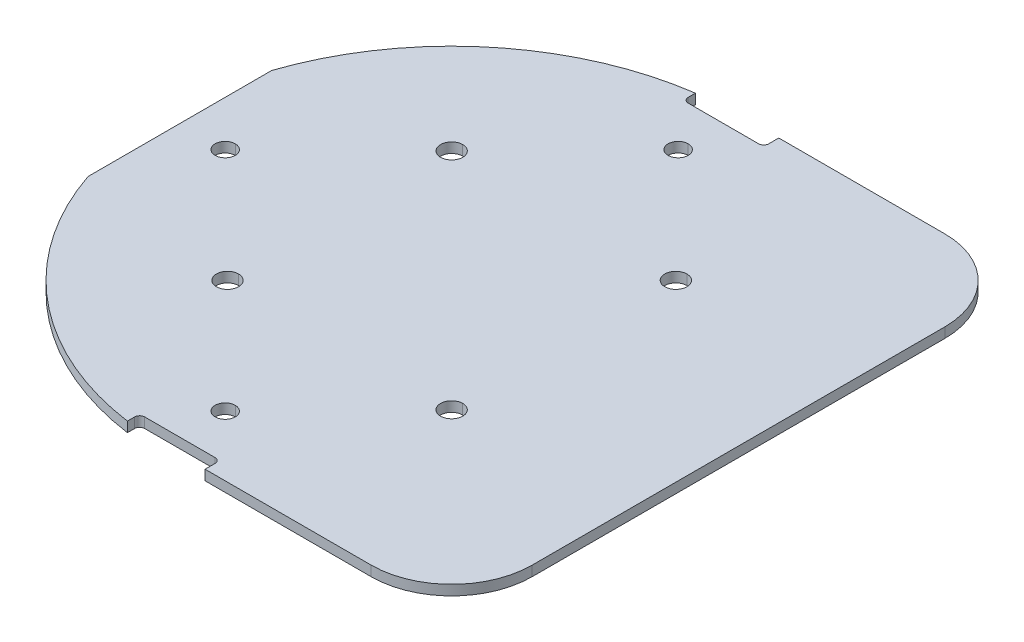
ISO-10303-21;
HEADER;
FILE_DESCRIPTION(('STEP AP214'),'2;1');
FILE_NAME('part.step','',(''),(''),'','','');
FILE_SCHEMA(('AUTOMOTIVE_DESIGN { 1 0 10303 214 1 1 1 1 }'));
ENDSEC;
DATA;
#1=APPLICATION_CONTEXT('core data for automotive mechanical design processes');
#2=APPLICATION_PROTOCOL_DEFINITION('international standard','automotive_design',2000,#1);
#3=PRODUCT_CONTEXT('',#1,'mechanical');
#4=PRODUCT('Part','Part','',(#3));
#5=PRODUCT_RELATED_PRODUCT_CATEGORY('part','',(#4));
#6=PRODUCT_DEFINITION_FORMATION('','',#4);
#7=PRODUCT_DEFINITION_CONTEXT('part definition',#1,'design');
#8=PRODUCT_DEFINITION('design','',#6,#7);
#9=PRODUCT_DEFINITION_SHAPE('','',#8);
#10=(LENGTH_UNIT() NAMED_UNIT(*) SI_UNIT(.MILLI.,.METRE.));
#11=(NAMED_UNIT(*) PLANE_ANGLE_UNIT() SI_UNIT($,.RADIAN.));
#12=(NAMED_UNIT(*) SI_UNIT($,.STERADIAN.) SOLID_ANGLE_UNIT());
#13=UNCERTAINTY_MEASURE_WITH_UNIT(LENGTH_MEASURE(1.E-05),#10,'distance_accuracy_value','');
#14=(GEOMETRIC_REPRESENTATION_CONTEXT(3) GLOBAL_UNCERTAINTY_ASSIGNED_CONTEXT((#13)) GLOBAL_UNIT_ASSIGNED_CONTEXT((#10,
#11,#12)) REPRESENTATION_CONTEXT('',''));
#15=CARTESIAN_POINT('',(0.,0.,0.));
#16=DIRECTION('',(0.,0.,1.));
#17=DIRECTION('',(1.,0.,0.));
#18=AXIS2_PLACEMENT_3D('',#15,#16,#17);
#19=CARTESIAN_POINT('',(-22.5,0.999999999999361,0.));
#20=DIRECTION('',(0.,-1.,0.));
#21=DIRECTION('',(0.,0.,-1.));
#22=AXIS2_PLACEMENT_3D('',#19,#20,#21);
#23=CYLINDRICAL_SURFACE('',#22,0.999999999999987);
#24=DIRECTION('',(0.,-1.,0.));
#25=VECTOR('',#24,1.);
#26=CARTESIAN_POINT('',(-22.5,0.5,-1.));
#27=LINE('',#26,#25);
#28=CARTESIAN_POINT('',(-22.5,1.,-1.));
#29=VERTEX_POINT('',#28);
#30=CARTESIAN_POINT('',(-22.5,0.,-1.));
#31=VERTEX_POINT('',#30);
#32=EDGE_CURVE('E560',#29,#31,#27,.T.);
#33=ORIENTED_EDGE('',*,*,#32,.F.);
#34=CARTESIAN_POINT('',(-22.4999999999981,1.,1.32533689224539E-12));
#35=DIRECTION('',(-6.3946244133235E-13,1.,0.));
#36=DIRECTION('',(-1.90125692966806E-12,0.,-1.));
#37=AXIS2_PLACEMENT_3D('',#34,#35,#36);
#38=CIRCLE('',#37,1.00000000000128);
#39=CARTESIAN_POINT('',(-22.5,0.999999999999361,1.));
#40=VERTEX_POINT('',#39);
#41=EDGE_CURVE('E578',#29,#40,#38,.T.);
#42=ORIENTED_EDGE('',*,*,#41,.T.);
#43=DIRECTION('',(0.,-1.,0.));
#44=VECTOR('',#43,1.);
#45=CARTESIAN_POINT('',(-22.5,0.499999999999361,1.));
#46=LINE('',#45,#44);
#47=CARTESIAN_POINT('',(-22.5,-6.3948846218409E-13,1.));
#48=VERTEX_POINT('',#47);
#49=EDGE_CURVE('E553',#40,#48,#46,.T.);
#50=ORIENTED_EDGE('',*,*,#49,.T.);
#51=CARTESIAN_POINT('',(-22.4999999999981,0.,1.32533689224539E-12));
#52=DIRECTION('',(-6.39427229844532E-13,1.,0.));
#53=DIRECTION('',(-1.90125692966806E-12,0.,-1.));
#54=AXIS2_PLACEMENT_3D('',#51,#52,#53);
#55=CIRCLE('',#54,1.00000000000128);
#56=EDGE_CURVE('E1241',#31,#48,#55,.T.);
#57=ORIENTED_EDGE('',*,*,#56,.F.);
#58=EDGE_LOOP('',(#33,#42,#50,#57));
#59=FACE_BOUND('',#58,.T.);
#60=ADVANCED_FACE('F16',(#59),#23,.F.);
#61=CARTESIAN_POINT('',(0.,1.,22.5));
#62=DIRECTION('',(0.,-1.,0.));
#63=DIRECTION('',(0.,0.,-1.));
#64=AXIS2_PLACEMENT_3D('',#61,#62,#63);
#65=CYLINDRICAL_SURFACE('',#64,0.999999999999988);
#66=DIRECTION('',(0.,-1.,0.));
#67=VECTOR('',#66,1.);
#68=CARTESIAN_POINT('',(0.,0.5,21.5));
#69=LINE('',#68,#67);
#70=CARTESIAN_POINT('',(0.,1.,21.5));
#71=VERTEX_POINT('',#70);
#72=CARTESIAN_POINT('',(0.,0.,21.5));
#73=VERTEX_POINT('',#72);
#74=EDGE_CURVE('E545',#71,#73,#69,.T.);
#75=ORIENTED_EDGE('',*,*,#74,.F.);
#76=CARTESIAN_POINT('',(2.57779908530485E-12,1.,22.5000000000013));
#77=DIRECTION('',(0.,1.,0.));
#78=DIRECTION('',(-2.57779908530149E-12,0.,-1.));
#79=AXIS2_PLACEMENT_3D('',#76,#77,#78);
#80=CIRCLE('',#79,1.00000000000127);
#81=CARTESIAN_POINT('',(0.,1.,23.5));
#82=VERTEX_POINT('',#81);
#83=EDGE_CURVE('E11',#71,#82,#80,.T.);
#84=ORIENTED_EDGE('',*,*,#83,.T.);
#85=DIRECTION('',(0.,-1.,0.));
#86=VECTOR('',#85,1.);
#87=CARTESIAN_POINT('',(0.,0.5,23.5));
#88=LINE('',#87,#86);
#89=CARTESIAN_POINT('',(0.,0.,23.5));
#90=VERTEX_POINT('',#89);
#91=EDGE_CURVE('E537',#82,#90,#88,.T.);
#92=ORIENTED_EDGE('',*,*,#91,.T.);
#93=CARTESIAN_POINT('',(2.60555466092052E-12,0.,22.5000000000013));
#94=DIRECTION('',(0.,1.,0.));
#95=DIRECTION('',(-2.60555466091713E-12,0.,-1.));
#96=AXIS2_PLACEMENT_3D('',#93,#94,#95);
#97=CIRCLE('',#96,1.00000000000128);
#98=EDGE_CURVE('E914',#73,#90,#97,.T.);
#99=ORIENTED_EDGE('',*,*,#98,.F.);
#100=EDGE_LOOP('',(#75,#84,#92,#99));
#101=FACE_BOUND('',#100,.T.);
#102=ADVANCED_FACE('F1002',(#101),#65,.F.);
#103=CARTESIAN_POINT('',(-11.136931804,1.0000000003119,11.136931804));
#104=DIRECTION('',(0.,-1.,0.));
#105=DIRECTION('',(0.,0.,-1.));
#106=AXIS2_PLACEMENT_3D('',#103,#104,#105);
#107=CYLINDRICAL_SURFACE('',#106,1.1);
#108=DIRECTION('',(0.,-1.,0.));
#109=VECTOR('',#108,1.);
#110=CARTESIAN_POINT('',(-11.136931804,0.5,10.036931804));
#111=LINE('',#110,#109);
#112=CARTESIAN_POINT('',(-11.136931804,1.,10.036931804));
#113=VERTEX_POINT('',#112);
#114=CARTESIAN_POINT('',(-11.136931804,0.,10.036931804));
#115=VERTEX_POINT('',#114);
#116=EDGE_CURVE('E529',#113,#115,#111,.T.);
#117=ORIENTED_EDGE('',*,*,#116,.F.);
#118=CARTESIAN_POINT('',(-11.1369318036881,1.,11.136931804));
#119=DIRECTION('',(2.83545874675836E-10,1.,0.));
#120=DIRECTION('',(-2.83543706191093E-10,0.,-1.));
#121=AXIS2_PLACEMENT_3D('',#118,#119,#120);
#122=CIRCLE('',#121,1.1);
#123=CARTESIAN_POINT('',(-11.136931804,1.0000000003119,12.236931804));
#124=VERTEX_POINT('',#123);
#125=EDGE_CURVE('E872',#113,#124,#122,.T.);
#126=ORIENTED_EDGE('',*,*,#125,.T.);
#127=DIRECTION('',(0.,-1.,0.));
#128=VECTOR('',#127,1.);
#129=CARTESIAN_POINT('',(-11.136931804,0.500000000311901,12.236931804));
#130=LINE('',#129,#128);
#131=CARTESIAN_POINT('',(-11.136931804,3.11901546257154E-10,12.236931804));
#132=VERTEX_POINT('',#131);
#133=EDGE_CURVE('E521',#124,#132,#130,.T.);
#134=ORIENTED_EDGE('',*,*,#133,.T.);
#135=CARTESIAN_POINT('',(-11.1369318036881,0.,11.136931804));
#136=DIRECTION('',(2.83546984627368E-10,1.,0.));
#137=DIRECTION('',(-2.83543706191093E-10,0.,-1.));
#138=AXIS2_PLACEMENT_3D('',#135,#136,#137);
#139=CIRCLE('',#138,1.1);
#140=EDGE_CURVE('E912',#115,#132,#139,.T.);
#141=ORIENTED_EDGE('',*,*,#140,.F.);
#142=EDGE_LOOP('',(#117,#126,#134,#141));
#143=FACE_BOUND('',#142,.T.);
#144=ADVANCED_FACE('F993',(#143),#107,.F.);
#145=CARTESIAN_POINT('',(0.,1.,-22.5));
#146=DIRECTION('',(0.,-1.,0.));
#147=DIRECTION('',(0.,0.,-1.));
#148=AXIS2_PLACEMENT_3D('',#145,#146,#147);
#149=CYLINDRICAL_SURFACE('',#148,1.00000000000001);
#150=DIRECTION('',(0.,-1.,0.));
#151=VECTOR('',#150,1.);
#152=CARTESIAN_POINT('',(0.,0.5,-23.5));
#153=LINE('',#152,#151);
#154=CARTESIAN_POINT('',(0.,1.,-23.5));
#155=VERTEX_POINT('',#154);
#156=CARTESIAN_POINT('',(0.,0.,-23.5));
#157=VERTEX_POINT('',#156);
#158=EDGE_CURVE('E513',#155,#157,#153,.T.);
#159=ORIENTED_EDGE('',*,*,#158,.F.);
#160=CARTESIAN_POINT('',(0.,1.,-22.5));
#161=DIRECTION('',(0.,1.,0.));
#162=DIRECTION('',(0.,0.,-1.));
#163=AXIS2_PLACEMENT_3D('',#160,#161,#162);
#164=CIRCLE('',#163,0.999999999999991);
#165=CARTESIAN_POINT('',(0.,1.,-21.5));
#166=VERTEX_POINT('',#165);
#167=EDGE_CURVE('E27',#155,#166,#164,.T.);
#168=ORIENTED_EDGE('',*,*,#167,.T.);
#169=DIRECTION('',(0.,-1.,0.));
#170=VECTOR('',#169,1.);
#171=CARTESIAN_POINT('',(0.,0.5,-21.5));
#172=LINE('',#171,#170);
#173=CARTESIAN_POINT('',(0.,0.,-21.5));
#174=VERTEX_POINT('',#173);
#175=EDGE_CURVE('E505',#166,#174,#172,.T.);
#176=ORIENTED_EDGE('',*,*,#175,.T.);
#177=CARTESIAN_POINT('',(0.,0.,-22.5));
#178=DIRECTION('',(0.,1.,0.));
#179=DIRECTION('',(0.,0.,-1.));
#180=AXIS2_PLACEMENT_3D('',#177,#178,#179);
#181=CIRCLE('',#180,0.999999999999991);
#182=EDGE_CURVE('E867',#157,#174,#181,.T.);
#183=ORIENTED_EDGE('',*,*,#182,.F.);
#184=EDGE_LOOP('',(#159,#168,#176,#183));
#185=FACE_BOUND('',#184,.T.);
#186=ADVANCED_FACE('F988',(#185),#149,.F.);
#187=CARTESIAN_POINT('',(11.136931804,1.0000000003119,11.136931804));
#188=DIRECTION('',(0.,-1.,0.));
#189=DIRECTION('',(0.,0.,-1.));
#190=AXIS2_PLACEMENT_3D('',#187,#188,#189);
#191=CYLINDRICAL_SURFACE('',#190,1.1);
#192=DIRECTION('',(0.,-1.,0.));
#193=VECTOR('',#192,1.);
#194=CARTESIAN_POINT('',(11.136931804,0.5,10.036931804));
#195=LINE('',#194,#193);
#196=CARTESIAN_POINT('',(11.136931804,1.,10.036931804));
#197=VERTEX_POINT('',#196);
#198=CARTESIAN_POINT('',(11.136931804,0.,10.036931804));
#199=VERTEX_POINT('',#198);
#200=EDGE_CURVE('E497',#197,#199,#195,.T.);
#201=ORIENTED_EDGE('',*,*,#200,.F.);
#202=CARTESIAN_POINT('',(11.1369318026076,0.999999999688101,11.1369318027524));
#203=DIRECTION('',(4.91114494869207E-10,1.,2.83544297366866E-10));
#204=DIRECTION('',(1.26580406653582E-09,2.8354429789569E-10,-1.));
#205=AXIS2_PLACEMENT_3D('',#202,#203,#204);
#206=CIRCLE('',#205,1.09999999875983);
#207=CARTESIAN_POINT('',(11.136931804,1.0000000003119,12.236931804));
#208=VERTEX_POINT('',#207);
#209=EDGE_CURVE('E896',#197,#208,#206,.T.);
#210=ORIENTED_EDGE('',*,*,#209,.T.);
#211=DIRECTION('',(0.,-1.,0.));
#212=VECTOR('',#211,1.);
#213=CARTESIAN_POINT('',(11.136931804,0.500000000311901,12.236931804));
#214=LINE('',#213,#212);
#215=CARTESIAN_POINT('',(11.136931804,3.11901546257154E-10,12.236931804));
#216=VERTEX_POINT('',#215);
#217=EDGE_CURVE('E489',#208,#216,#214,.T.);
#218=ORIENTED_EDGE('',*,*,#217,.T.);
#219=CARTESIAN_POINT('',(11.1369318026076,-3.11901749091702E-10,11.1369318027524));
#220=DIRECTION('',(4.91117783102196E-10,1.,2.83547045572078E-10));
#221=DIRECTION('',(1.26580722057851E-09,2.83547044950418E-10,-1.));
#222=AXIS2_PLACEMENT_3D('',#219,#220,#221);
#223=CIRCLE('',#222,1.09999999875983);
#224=EDGE_CURVE('E863',#199,#216,#223,.T.);
#225=ORIENTED_EDGE('',*,*,#224,.F.);
#226=EDGE_LOOP('',(#201,#210,#218,#225));
#227=FACE_BOUND('',#226,.T.);
#228=ADVANCED_FACE('F992',(#227),#191,.F.);
#229=CARTESIAN_POINT('',(11.136931804,0.999999999688099,-11.136931804));
#230=DIRECTION('',(0.,-1.,0.));
#231=DIRECTION('',(0.,0.,-1.));
#232=AXIS2_PLACEMENT_3D('',#229,#230,#231);
#233=CYLINDRICAL_SURFACE('',#232,1.1);
#234=DIRECTION('',(0.,-1.,0.));
#235=VECTOR('',#234,1.);
#236=CARTESIAN_POINT('',(11.136931804,0.5,-12.236931804));
#237=LINE('',#236,#235);
#238=CARTESIAN_POINT('',(11.136931804,1.,-12.236931804));
#239=VERTEX_POINT('',#238);
#240=CARTESIAN_POINT('',(11.136931804,0.,-12.236931804));
#241=VERTEX_POINT('',#240);
#242=EDGE_CURVE('E481',#239,#241,#237,.T.);
#243=ORIENTED_EDGE('',*,*,#242,.F.);
#244=CARTESIAN_POINT('',(11.1369318036881,1.0000000003119,-11.136931804));
#245=DIRECTION('',(-4.91116543758531E-10,1.,-2.83546268804393E-10));
#246=DIRECTION('',(2.83565784489879E-10,-2.83546268850774E-10,-1.));
#247=AXIS2_PLACEMENT_3D('',#244,#245,#246);
#248=CIRCLE('',#247,1.1);
#249=CARTESIAN_POINT('',(11.136931804,0.999999999688099,-10.036931804));
#250=VERTEX_POINT('',#249);
#251=EDGE_CURVE('E1283',#239,#250,#248,.T.);
#252=ORIENTED_EDGE('',*,*,#251,.T.);
#253=DIRECTION('',(0.,-1.,0.));
#254=VECTOR('',#253,1.);
#255=CARTESIAN_POINT('',(11.136931804,0.499999999688099,-10.036931804));
#256=LINE('',#255,#254);
#257=CARTESIAN_POINT('',(11.136931804,-3.11901685035032E-10,-10.036931804));
#258=VERTEX_POINT('',#257);
#259=EDGE_CURVE('E473',#250,#258,#256,.T.);
#260=ORIENTED_EDGE('',*,*,#259,.T.);
#261=CARTESIAN_POINT('',(11.1369318036881,3.11901480730735E-10,-11.136931804));
#262=DIRECTION('',(-4.91117571265659E-10,1.,-2.83546800803571E-10));
#263=DIRECTION('',(2.83568938532563E-10,-2.83546800664305E-10,-1.));
#264=AXIS2_PLACEMENT_3D('',#261,#262,#263);
#265=CIRCLE('',#264,1.1);
#266=EDGE_CURVE('E866',#241,#258,#265,.T.);
#267=ORIENTED_EDGE('',*,*,#266,.F.);
#268=EDGE_LOOP('',(#243,#252,#260,#267));
#269=FACE_BOUND('',#268,.T.);
#270=ADVANCED_FACE('F1019',(#269),#233,.F.);
#271=CARTESIAN_POINT('',(-11.136931804,0.999999999688099,-11.136931804));
#272=DIRECTION('',(0.,-1.,0.));
#273=DIRECTION('',(0.,0.,-1.));
#274=AXIS2_PLACEMENT_3D('',#271,#272,#273);
#275=CYLINDRICAL_SURFACE('',#274,1.1);
#276=DIRECTION('',(0.,-1.,0.));
#277=VECTOR('',#276,1.);
#278=CARTESIAN_POINT('',(-11.136931804,0.5,-12.236931804));
#279=LINE('',#278,#277);
#280=CARTESIAN_POINT('',(-11.136931804,1.,-12.236931804));
#281=VERTEX_POINT('',#280);
#282=CARTESIAN_POINT('',(-11.136931804,0.,-12.236931804));
#283=VERTEX_POINT('',#282);
#284=EDGE_CURVE('E465',#281,#283,#279,.T.);
#285=ORIENTED_EDGE('',*,*,#284,.F.);
#286=CARTESIAN_POINT('',(-11.1369318030644,1.,-11.1369318033763));
#287=DIRECTION('',(-2.83546071803503E-10,1.,0.));
#288=DIRECTION('',(-8.50542804895879E-10,0.,-1.));
#289=AXIS2_PLACEMENT_3D('',#286,#287,#288);
#290=CIRCLE('',#289,1.10000000060586);
#291=CARTESIAN_POINT('',(-11.136931804,0.999999999688099,-10.036931804));
#292=VERTEX_POINT('',#291);
#293=EDGE_CURVE('E899',#281,#292,#290,.T.);
#294=ORIENTED_EDGE('',*,*,#293,.T.);
#295=DIRECTION('',(0.,-1.,0.));
#296=VECTOR('',#295,1.);
#297=CARTESIAN_POINT('',(-11.136931804,0.499999999688099,-10.036931804));
#298=LINE('',#297,#296);
#299=CARTESIAN_POINT('',(-11.136931804,-3.11901685035032E-10,-10.036931804));
#300=VERTEX_POINT('',#299);
#301=EDGE_CURVE('E457',#292,#300,#298,.T.);
#302=ORIENTED_EDGE('',*,*,#301,.T.);
#303=CARTESIAN_POINT('',(-11.1369318030644,0.,-11.1369318033763));
#304=DIRECTION('',(-2.83546862162688E-10,1.,0.));
#305=DIRECTION('',(-8.50552267023926E-10,0.,-1.));
#306=AXIS2_PLACEMENT_3D('',#303,#304,#305);
#307=CIRCLE('',#306,1.10000000060587);
#308=EDGE_CURVE('E1277',#283,#300,#307,.T.);
#309=ORIENTED_EDGE('',*,*,#308,.F.);
#310=EDGE_LOOP('',(#285,#294,#302,#309));
#311=FACE_BOUND('',#310,.T.);
#312=ADVANCED_FACE('F944',(#311),#275,.F.);
#313=CARTESIAN_POINT('',(0.,0.,0.));
#314=DIRECTION('',(0.,1.,0.));
#315=DIRECTION('',(0.,0.,1.));
#316=AXIS2_PLACEMENT_3D('',#313,#314,#315);
#317=CYLINDRICAL_SURFACE('',#316,28.5000000000001);
#318=CARTESIAN_POINT('',(-1.13054531014622E-10,0.,2.8363509457785E-10));
#319=DIRECTION('',(0.,1.,0.));
#320=DIRECTION('',(-0.947368421060004,0.,0.320145396309669));
#321=AXIS2_PLACEMENT_3D('',#318,#319,#320);
#322=CIRCLE('',#321,28.4999999996614);
#323=CARTESIAN_POINT('',(-27.,0.,9.124143795));
#324=VERTEX_POINT('',#323);
#325=CARTESIAN_POINT('',(-4.,0.,28.217902119));
#326=VERTEX_POINT('',#325);
#327=EDGE_CURVE('E1264',#324,#326,#322,.T.);
#328=ORIENTED_EDGE('',*,*,#327,.T.);
#329=DIRECTION('',(0.,-1.,0.));
#330=VECTOR('',#329,1.);
#331=CARTESIAN_POINT('',(-4.,0.5,28.217902119));
#332=LINE('',#331,#330);
#333=CARTESIAN_POINT('',(-4.,1.,28.217902119));
#334=VERTEX_POINT('',#333);
#335=EDGE_CURVE('E375',#334,#326,#332,.T.);
#336=ORIENTED_EDGE('',*,*,#335,.F.);
#337=CARTESIAN_POINT('',(-1.13054531014622E-10,1.,2.8363509457785E-10));
#338=DIRECTION('',(0.,1.,0.));
#339=DIRECTION('',(-0.947368421060004,0.,0.320145396309669));
#340=AXIS2_PLACEMENT_3D('',#337,#338,#339);
#341=CIRCLE('',#340,28.4999999996614);
#342=CARTESIAN_POINT('',(-27.,1.,9.124143795));
#343=VERTEX_POINT('',#342);
#344=EDGE_CURVE('E873',#343,#334,#341,.T.);
#345=ORIENTED_EDGE('',*,*,#344,.F.);
#346=DIRECTION('',(0.,1.,0.));
#347=VECTOR('',#346,1.);
#348=CARTESIAN_POINT('',(-27.,0.5,9.124143795));
#349=LINE('',#348,#347);
#350=EDGE_CURVE('E332',#324,#343,#349,.T.);
#351=ORIENTED_EDGE('',*,*,#350,.F.);
#352=EDGE_LOOP('',(#328,#336,#345,#351));
#353=FACE_BOUND('',#352,.T.);
#354=ADVANCED_FACE('F940',(#353),#317,.T.);
#355=CARTESIAN_POINT('',(-27.0100000001357,1.,-28.51));
#356=DIRECTION('',(0.,1.,0.));
#357=DIRECTION('',(0.,0.,1.));
#358=AXIS2_PLACEMENT_3D('',#355,#356,#357);
#359=PLANE('',#358);
#360=ORIENTED_EDGE('',*,*,#83,.F.);
#361=CARTESIAN_POINT('',(2.62984078957746E-12,1.,22.5000000000013));
#362=DIRECTION('',(0.,1.,0.));
#363=DIRECTION('',(-2.62984078958088E-12,0.,1.));
#364=AXIS2_PLACEMENT_3D('',#361,#362,#363);
#365=CIRCLE('',#364,0.999999999998709);
#366=EDGE_CURVE('E549',#82,#71,#365,.T.);
#367=ORIENTED_EDGE('',*,*,#366,.F.);
#368=EDGE_LOOP('',(#360,#367));
#369=FACE_BOUND('',#368,.T.);
#370=ORIENTED_EDGE('',*,*,#167,.F.);
#371=CARTESIAN_POINT('',(0.,1.,-22.5));
#372=DIRECTION('',(0.,1.,0.));
#373=DIRECTION('',(0.,0.,1.));
#374=AXIS2_PLACEMENT_3D('',#371,#372,#373);
#375=CIRCLE('',#374,0.999999999999997);
#376=EDGE_CURVE('E517',#166,#155,#375,.T.);
#377=ORIENTED_EDGE('',*,*,#376,.F.);
#378=EDGE_LOOP('',(#370,#377));
#379=FACE_BOUND('',#378,.T.);
#380=ORIENTED_EDGE('',*,*,#251,.F.);
#381=CARTESIAN_POINT('',(11.1369318036881,0.999999999688099,-11.136931804));
#382=DIRECTION('',(0.,1.,0.));
#383=DIRECTION('',(2.83543706191093E-10,0.,1.));
#384=AXIS2_PLACEMENT_3D('',#381,#382,#383);
#385=CIRCLE('',#384,1.1);
#386=EDGE_CURVE('E485',#250,#239,#385,.T.);
#387=ORIENTED_EDGE('',*,*,#386,.F.);
#388=EDGE_LOOP('',(#380,#387));
#389=FACE_BOUND('',#388,.T.);
#390=ORIENTED_EDGE('',*,*,#293,.F.);
#391=CARTESIAN_POINT('',(-11.1369318026078,0.999999999688099,-11.1369318027526));
#392=DIRECTION('',(0.,1.,0.));
#393=DIRECTION('',(-1.26565898057199E-09,0.,1.));
#394=AXIS2_PLACEMENT_3D('',#391,#392,#393);
#395=CIRCLE('',#394,1.09999999876002);
#396=EDGE_CURVE('E469',#292,#281,#395,.T.);
#397=ORIENTED_EDGE('',*,*,#396,.F.);
#398=EDGE_LOOP('',(#390,#397));
#399=FACE_BOUND('',#398,.T.);
#400=ORIENTED_EDGE('',*,*,#209,.F.);
#401=CARTESIAN_POINT('',(11.1369318030643,1.0000000003119,11.1369318033762));
#402=DIRECTION('',(0.,1.,0.));
#403=DIRECTION('',(8.50632695112234E-10,0.,1.));
#404=AXIS2_PLACEMENT_3D('',#401,#402,#403);
#405=CIRCLE('',#404,1.10000000060596);
#406=EDGE_CURVE('E501',#208,#197,#405,.T.);
#407=ORIENTED_EDGE('',*,*,#406,.F.);
#408=EDGE_LOOP('',(#400,#407));
#409=FACE_BOUND('',#408,.T.);
#410=ORIENTED_EDGE('',*,*,#125,.F.);
#411=CARTESIAN_POINT('',(-11.1369318036882,1.0000000003119,11.1369318039998));
#412=DIRECTION('',(0.,1.,0.));
#413=DIRECTION('',(-2.83449084910545E-10,0.,1.));
#414=AXIS2_PLACEMENT_3D('',#411,#412,#413);
#415=CIRCLE('',#414,1.10000000000015);
#416=EDGE_CURVE('E533',#124,#113,#415,.T.);
#417=ORIENTED_EDGE('',*,*,#416,.F.);
#418=EDGE_LOOP('',(#410,#417));
#419=FACE_BOUND('',#418,.T.);
#420=ORIENTED_EDGE('',*,*,#41,.F.);
#421=CARTESIAN_POINT('',(-22.4999999999981,0.999999999999361,1.32920687665166E-12));
#422=DIRECTION('',(0.,1.,0.));
#423=DIRECTION('',(-1.90125692967311E-12,0.,1.));
#424=AXIS2_PLACEMENT_3D('',#421,#422,#423);
#425=CIRCLE('',#424,0.999999999998722);
#426=EDGE_CURVE('E20',#40,#29,#425,.T.);
#427=ORIENTED_EDGE('',*,*,#426,.F.);
#428=EDGE_LOOP('',(#420,#427));
#429=FACE_BOUND('',#428,.T.);
#430=DIRECTION('',(0.,0.,-1.));
#431=VECTOR('',#430,1.);
#432=CARTESIAN_POINT('',(4.,1.,28.));
#433=LINE('',#432,#431);
#434=CARTESIAN_POINT('',(4.,1.,28.5));
#435=VERTEX_POINT('',#434);
#436=CARTESIAN_POINT('',(4.,1.,27.5));
#437=VERTEX_POINT('',#436);
#438=EDGE_CURVE('E372',#435,#437,#433,.T.);
#439=ORIENTED_EDGE('',*,*,#438,.F.);
#440=DIRECTION('',(1.,0.,0.));
#441=VECTOR('',#440,1.);
#442=CARTESIAN_POINT('',(12.25,1.,28.5));
#443=LINE('',#442,#441);
#444=CARTESIAN_POINT('',(20.5,1.,28.5));
#445=VERTEX_POINT('',#444);
#446=EDGE_CURVE('E42',#435,#445,#443,.T.);
#447=ORIENTED_EDGE('',*,*,#446,.T.);
#448=CARTESIAN_POINT('',(20.5,1.,20.5));
#449=DIRECTION('',(0.,1.,0.));
#450=DIRECTION('',(0.,0.,1.));
#451=AXIS2_PLACEMENT_3D('',#448,#449,#450);
#452=CIRCLE('',#451,7.99999999999999);
#453=CARTESIAN_POINT('',(28.5,1.,20.5));
#454=VERTEX_POINT('',#453);
#455=EDGE_CURVE('E282',#445,#454,#452,.T.);
#456=ORIENTED_EDGE('',*,*,#455,.T.);
#457=DIRECTION('',(0.,0.,-1.));
#458=VECTOR('',#457,1.);
#459=CARTESIAN_POINT('',(28.5,1.,0.));
#460=LINE('',#459,#458);
#461=CARTESIAN_POINT('',(28.5,1.,-20.5));
#462=VERTEX_POINT('',#461);
#463=EDGE_CURVE('E275',#454,#462,#460,.T.);
#464=ORIENTED_EDGE('',*,*,#463,.T.);
#465=CARTESIAN_POINT('',(20.5,1.,-20.5));
#466=DIRECTION('',(0.,1.,0.));
#467=DIRECTION('',(1.,0.,0.));
#468=AXIS2_PLACEMENT_3D('',#465,#466,#467);
#469=CIRCLE('',#468,8.00000000000002);
#470=CARTESIAN_POINT('',(20.5,1.,-28.5));
#471=VERTEX_POINT('',#470);
#472=EDGE_CURVE('E279',#462,#471,#469,.T.);
#473=ORIENTED_EDGE('',*,*,#472,.T.);
#474=DIRECTION('',(-1.,0.,0.));
#475=VECTOR('',#474,1.);
#476=CARTESIAN_POINT('',(12.25,1.,-28.5));
#477=LINE('',#476,#475);
#478=CARTESIAN_POINT('',(4.,1.,-28.5));
#479=VERTEX_POINT('',#478);
#480=EDGE_CURVE('E314',#471,#479,#477,.T.);
#481=ORIENTED_EDGE('',*,*,#480,.T.);
#482=DIRECTION('',(0.,0.,-1.));
#483=VECTOR('',#482,1.);
#484=CARTESIAN_POINT('',(4.,1.,-28.));
#485=LINE('',#484,#483);
#486=CARTESIAN_POINT('',(4.,1.,-27.5));
#487=VERTEX_POINT('',#486);
#488=EDGE_CURVE('E340',#487,#479,#485,.T.);
#489=ORIENTED_EDGE('',*,*,#488,.F.);
#490=CARTESIAN_POINT('',(3.49999999999998,1.,-27.5));
#491=DIRECTION('',(0.,-1.,0.));
#492=DIRECTION('',(1.,0.,0.));
#493=AXIS2_PLACEMENT_3D('',#490,#491,#492);
#494=CIRCLE('',#493,0.500000000000009);
#495=CARTESIAN_POINT('',(3.5,1.,-27.));
#496=VERTEX_POINT('',#495);
#497=EDGE_CURVE('E413',#487,#496,#494,.T.);
#498=ORIENTED_EDGE('',*,*,#497,.T.);
#499=DIRECTION('',(1.,0.,0.));
#500=VECTOR('',#499,1.);
#501=CARTESIAN_POINT('',(0.,1.,-27.));
#502=LINE('',#501,#500);
#503=CARTESIAN_POINT('',(-3.5,1.,-27.));
#504=VERTEX_POINT('',#503);
#505=EDGE_CURVE('E347',#504,#496,#502,.T.);
#506=ORIENTED_EDGE('',*,*,#505,.F.);
#507=CARTESIAN_POINT('',(-3.50000000000003,1.,-27.5));
#508=DIRECTION('',(0.,-1.,0.));
#509=DIRECTION('',(0.,0.,1.));
#510=AXIS2_PLACEMENT_3D('',#507,#508,#509);
#511=CIRCLE('',#510,0.49999999999999);
#512=CARTESIAN_POINT('',(-4.,1.,-27.5));
#513=VERTEX_POINT('',#512);
#514=EDGE_CURVE('E397',#504,#513,#511,.T.);
#515=ORIENTED_EDGE('',*,*,#514,.T.);
#516=DIRECTION('',(0.,0.,1.));
#517=VECTOR('',#516,1.);
#518=CARTESIAN_POINT('',(-4.,1.,-27.8589510595));
#519=LINE('',#518,#517);
#520=CARTESIAN_POINT('',(-4.,1.,-28.217902119));
#521=VERTEX_POINT('',#520);
#522=EDGE_CURVE('E361',#521,#513,#519,.T.);
#523=ORIENTED_EDGE('',*,*,#522,.F.);
#524=CARTESIAN_POINT('',(-1.13077949781548E-10,1.,-2.83607339002234E-10));
#525=DIRECTION('',(0.,1.,0.));
#526=DIRECTION('',(-0.140350877190695,0.,-0.990101828738743));
#527=AXIS2_PLACEMENT_3D('',#524,#525,#526);
#528=CIRCLE('',#527,28.4999999996614);
#529=CARTESIAN_POINT('',(-27.,1.,-9.124143795));
#530=VERTEX_POINT('',#529);
#531=EDGE_CURVE('E838',#521,#530,#528,.T.);
#532=ORIENTED_EDGE('',*,*,#531,.T.);
#533=DIRECTION('',(0.,0.,-1.));
#534=VECTOR('',#533,1.);
#535=CARTESIAN_POINT('',(-27.,1.,0.));
#536=LINE('',#535,#534);
#537=EDGE_CURVE('E328',#343,#530,#536,.T.);
#538=ORIENTED_EDGE('',*,*,#537,.F.);
#539=ORIENTED_EDGE('',*,*,#344,.T.);
#540=DIRECTION('',(0.,0.,1.));
#541=VECTOR('',#540,1.);
#542=CARTESIAN_POINT('',(-4.,1.,27.8589510595));
#543=LINE('',#542,#541);
#544=CARTESIAN_POINT('',(-4.,1.,27.5));
#545=VERTEX_POINT('',#544);
#546=EDGE_CURVE('E379',#545,#334,#543,.T.);
#547=ORIENTED_EDGE('',*,*,#546,.F.);
#548=CARTESIAN_POINT('',(-3.5,1.,27.5));
#549=DIRECTION('',(0.,-1.,0.));
#550=DIRECTION('',(-1.,0.,0.));
#551=AXIS2_PLACEMENT_3D('',#548,#549,#550);
#552=CIRCLE('',#551,0.500000000000023);
#553=CARTESIAN_POINT('',(-3.5,1.,27.));
#554=VERTEX_POINT('',#553);
#555=EDGE_CURVE('E445',#545,#554,#552,.T.);
#556=ORIENTED_EDGE('',*,*,#555,.T.);
#557=DIRECTION('',(-1.,0.,0.));
#558=VECTOR('',#557,1.);
#559=CARTESIAN_POINT('',(0.,1.,27.));
#560=LINE('',#559,#558);
#561=CARTESIAN_POINT('',(3.5,1.,27.));
#562=VERTEX_POINT('',#561);
#563=EDGE_CURVE('E386',#562,#554,#560,.T.);
#564=ORIENTED_EDGE('',*,*,#563,.F.);
#565=CARTESIAN_POINT('',(3.49999999999997,1.,27.5));
#566=DIRECTION('',(0.,-1.,0.));
#567=DIRECTION('',(0.,0.,-1.));
#568=AXIS2_PLACEMENT_3D('',#565,#566,#567);
#569=CIRCLE('',#568,0.500000000000019);
#570=EDGE_CURVE('E429',#562,#437,#569,.T.);
#571=ORIENTED_EDGE('',*,*,#570,.T.);
#572=EDGE_LOOP('',(#439,#447,#456,#464,#473,#481,#489,#498,#506,#515,#523,#532,#538,#539,#547,
#556,#564,#571));
#573=FACE_BOUND('',#572,.T.);
#574=ADVANCED_FACE('F277',(#369,#379,#389,#399,#409,#419,#429,#573),#359,.T.);
#575=CARTESIAN_POINT('',(-27.0100000001357,0.,28.51));
#576=DIRECTION('',(0.,-1.,0.));
#577=DIRECTION('',(0.,0.,-1.));
#578=AXIS2_PLACEMENT_3D('',#575,#576,#577);
#579=PLANE('',#578);
#580=ORIENTED_EDGE('',*,*,#308,.T.);
#581=CARTESIAN_POINT('',(-11.1369318026078,-3.11901619712823E-10,-11.1369318027526));
#582=DIRECTION('',(0.,1.,0.));
#583=DIRECTION('',(-1.26565898057199E-09,0.,1.));
#584=AXIS2_PLACEMENT_3D('',#581,#582,#583);
#585=CIRCLE('',#584,1.09999999876001);
#586=EDGE_CURVE('E461',#300,#283,#585,.T.);
#587=ORIENTED_EDGE('',*,*,#586,.T.);
#588=EDGE_LOOP('',(#580,#587));
#589=FACE_BOUND('',#588,.T.);
#590=ORIENTED_EDGE('',*,*,#266,.T.);
#591=CARTESIAN_POINT('',(11.1369318036881,-3.11901617679458E-10,-11.136931804));
#592=DIRECTION('',(0.,1.,0.));
#593=DIRECTION('',(2.83543706191093E-10,0.,1.));
#594=AXIS2_PLACEMENT_3D('',#591,#592,#593);
#595=CIRCLE('',#594,1.1);
#596=EDGE_CURVE('E477',#258,#241,#595,.T.);
#597=ORIENTED_EDGE('',*,*,#596,.T.);
#598=EDGE_LOOP('',(#590,#597));
#599=FACE_BOUND('',#598,.T.);
#600=ORIENTED_EDGE('',*,*,#224,.T.);
#601=CARTESIAN_POINT('',(11.1369318030643,3.11901613612728E-10,11.1369318033762));
#602=DIRECTION('',(0.,1.,0.));
#603=DIRECTION('',(8.50629541069554E-10,0.,1.));
#604=AXIS2_PLACEMENT_3D('',#601,#602,#603);
#605=CIRCLE('',#604,1.10000000060596);
#606=EDGE_CURVE('E493',#216,#199,#605,.T.);
#607=ORIENTED_EDGE('',*,*,#606,.T.);
#608=EDGE_LOOP('',(#600,#607));
#609=FACE_BOUND('',#608,.T.);
#610=ORIENTED_EDGE('',*,*,#182,.T.);
#611=CARTESIAN_POINT('',(0.,0.,-22.5));
#612=DIRECTION('',(0.,1.,0.));
#613=DIRECTION('',(0.,0.,1.));
#614=AXIS2_PLACEMENT_3D('',#611,#612,#613);
#615=CIRCLE('',#614,0.999999999999997);
#616=EDGE_CURVE('E509',#174,#157,#615,.T.);
#617=ORIENTED_EDGE('',*,*,#616,.T.);
#618=EDGE_LOOP('',(#610,#617));
#619=FACE_BOUND('',#618,.T.);
#620=ORIENTED_EDGE('',*,*,#140,.T.);
#621=CARTESIAN_POINT('',(-11.1369318036883,3.11901611579362E-10,11.1369318039998));
#622=DIRECTION('',(0.,1.,0.));
#623=DIRECTION('',(-2.8338285001417E-10,0.,1.));
#624=AXIS2_PLACEMENT_3D('',#621,#622,#623);
#625=CIRCLE('',#624,1.10000000000024);
#626=EDGE_CURVE('E525',#132,#115,#625,.T.);
#627=ORIENTED_EDGE('',*,*,#626,.T.);
#628=EDGE_LOOP('',(#620,#627));
#629=FACE_BOUND('',#628,.T.);
#630=ORIENTED_EDGE('',*,*,#98,.T.);
#631=CARTESIAN_POINT('',(2.60902410786577E-12,0.,22.5000000000013));
#632=DIRECTION('',(0.,1.,0.));
#633=DIRECTION('',(-2.60902410786916E-12,0.,1.));
#634=AXIS2_PLACEMENT_3D('',#631,#632,#633);
#635=CIRCLE('',#634,0.999999999998718);
#636=EDGE_CURVE('E541',#90,#73,#635,.T.);
#637=ORIENTED_EDGE('',*,*,#636,.T.);
#638=EDGE_LOOP('',(#630,#637));
#639=FACE_BOUND('',#638,.T.);
#640=ORIENTED_EDGE('',*,*,#56,.T.);
#641=CARTESIAN_POINT('',(-22.4999999999981,-6.39427229844133E-13,1.32920687665166E-12));
#642=DIRECTION('',(0.,1.,0.));
#643=DIRECTION('',(-1.90125692967311E-12,0.,1.));
#644=AXIS2_PLACEMENT_3D('',#641,#642,#643);
#645=CIRCLE('',#644,0.999999999998722);
#646=EDGE_CURVE('E557',#48,#31,#645,.T.);
#647=ORIENTED_EDGE('',*,*,#646,.T.);
#648=EDGE_LOOP('',(#640,#647));
#649=FACE_BOUND('',#648,.T.);
#650=DIRECTION('',(1.,0.,0.));
#651=VECTOR('',#650,1.);
#652=CARTESIAN_POINT('',(12.25,0.,28.5));
#653=LINE('',#652,#651);
#654=CARTESIAN_POINT('',(4.,0.,28.5));
#655=VERTEX_POINT('',#654);
#656=CARTESIAN_POINT('',(20.5,0.,28.5));
#657=VERTEX_POINT('',#656);
#658=EDGE_CURVE('E830',#655,#657,#653,.T.);
#659=ORIENTED_EDGE('',*,*,#658,.F.);
#660=DIRECTION('',(0.,0.,1.));
#661=VECTOR('',#660,1.);
#662=CARTESIAN_POINT('',(4.,0.,28.));
#663=LINE('',#662,#661);
#664=CARTESIAN_POINT('',(4.,0.,27.5));
#665=VERTEX_POINT('',#664);
#666=EDGE_CURVE('E368',#665,#655,#663,.T.);
#667=ORIENTED_EDGE('',*,*,#666,.F.);
#668=CARTESIAN_POINT('',(3.5,0.,27.5));
#669=DIRECTION('',(0.,1.,0.));
#670=DIRECTION('',(1.,0.,0.));
#671=AXIS2_PLACEMENT_3D('',#668,#669,#670);
#672=CIRCLE('',#671,0.500000000000001);
#673=CARTESIAN_POINT('',(3.5,0.,27.));
#674=VERTEX_POINT('',#673);
#675=EDGE_CURVE('E437',#665,#674,#672,.T.);
#676=ORIENTED_EDGE('',*,*,#675,.T.);
#677=DIRECTION('',(1.,0.,0.));
#678=VECTOR('',#677,1.);
#679=CARTESIAN_POINT('',(0.,0.,27.));
#680=LINE('',#679,#678);
#681=CARTESIAN_POINT('',(-3.5,0.,27.));
#682=VERTEX_POINT('',#681);
#683=EDGE_CURVE('E390',#682,#674,#680,.T.);
#684=ORIENTED_EDGE('',*,*,#683,.F.);
#685=CARTESIAN_POINT('',(-3.49999999999998,0.,27.5));
#686=DIRECTION('',(0.,1.,0.));
#687=DIRECTION('',(0.,0.,-1.));
#688=AXIS2_PLACEMENT_3D('',#685,#686,#687);
#689=CIRCLE('',#688,0.500000000000013);
#690=CARTESIAN_POINT('',(-4.,0.,27.5));
#691=VERTEX_POINT('',#690);
#692=EDGE_CURVE('E453',#682,#691,#689,.T.);
#693=ORIENTED_EDGE('',*,*,#692,.T.);
#694=DIRECTION('',(0.,0.,-1.));
#695=VECTOR('',#694,1.);
#696=CARTESIAN_POINT('',(-4.,0.,27.8589510595));
#697=LINE('',#696,#695);
#698=EDGE_CURVE('E383',#326,#691,#697,.T.);
#699=ORIENTED_EDGE('',*,*,#698,.F.);
#700=ORIENTED_EDGE('',*,*,#327,.F.);
#701=DIRECTION('',(0.,0.,1.));
#702=VECTOR('',#701,1.);
#703=CARTESIAN_POINT('',(-27.,0.,0.));
#704=LINE('',#703,#702);
#705=CARTESIAN_POINT('',(-27.,0.,-9.124143795));
#706=VERTEX_POINT('',#705);
#707=EDGE_CURVE('E320',#706,#324,#704,.T.);
#708=ORIENTED_EDGE('',*,*,#707,.F.);
#709=CARTESIAN_POINT('',(-1.13015066055544E-10,0.,-2.83531878531029E-10));
#710=DIRECTION('',(0.,1.,0.));
#711=DIRECTION('',(-0.140350877190697,0.,-0.990101828738742));
#712=AXIS2_PLACEMENT_3D('',#709,#710,#711);
#713=CIRCLE('',#712,28.4999999996615);
#714=CARTESIAN_POINT('',(-4.,0.,-28.217902119));
#715=VERTEX_POINT('',#714);
#716=EDGE_CURVE('E1257',#715,#706,#713,.T.);
#717=ORIENTED_EDGE('',*,*,#716,.F.);
#718=DIRECTION('',(0.,0.,-1.));
#719=VECTOR('',#718,1.);
#720=CARTESIAN_POINT('',(-4.,0.,-27.8589510595));
#721=LINE('',#720,#719);
#722=CARTESIAN_POINT('',(-4.,0.,-27.5));
#723=VERTEX_POINT('',#722);
#724=EDGE_CURVE('E357',#723,#715,#721,.T.);
#725=ORIENTED_EDGE('',*,*,#724,.F.);
#726=CARTESIAN_POINT('',(-3.50000000000001,0.,-27.5));
#727=DIRECTION('',(0.,1.,0.));
#728=DIRECTION('',(-1.,0.,0.));
#729=AXIS2_PLACEMENT_3D('',#726,#727,#728);
#730=CIRCLE('',#729,0.500000000000015);
#731=CARTESIAN_POINT('',(-3.5,0.,-27.));
#732=VERTEX_POINT('',#731);
#733=EDGE_CURVE('E405',#723,#732,#730,.T.);
#734=ORIENTED_EDGE('',*,*,#733,.T.);
#735=DIRECTION('',(-1.,0.,0.));
#736=VECTOR('',#735,1.);
#737=CARTESIAN_POINT('',(0.,0.,-27.));
#738=LINE('',#737,#736);
#739=CARTESIAN_POINT('',(3.5,0.,-27.));
#740=VERTEX_POINT('',#739);
#741=EDGE_CURVE('E350',#740,#732,#738,.T.);
#742=ORIENTED_EDGE('',*,*,#741,.F.);
#743=CARTESIAN_POINT('',(3.5,0.,-27.5));
#744=DIRECTION('',(0.,1.,0.));
#745=DIRECTION('',(0.,0.,1.));
#746=AXIS2_PLACEMENT_3D('',#743,#744,#745);
#747=CIRCLE('',#746,0.499999999999996);
#748=CARTESIAN_POINT('',(4.,0.,-27.5));
#749=VERTEX_POINT('',#748);
#750=EDGE_CURVE('E421',#740,#749,#747,.T.);
#751=ORIENTED_EDGE('',*,*,#750,.T.);
#752=DIRECTION('',(0.,0.,1.));
#753=VECTOR('',#752,1.);
#754=CARTESIAN_POINT('',(4.,0.,-28.));
#755=LINE('',#754,#753);
#756=CARTESIAN_POINT('',(4.,0.,-28.5));
#757=VERTEX_POINT('',#756);
#758=EDGE_CURVE('E344',#757,#749,#755,.T.);
#759=ORIENTED_EDGE('',*,*,#758,.F.);
#760=DIRECTION('',(-1.,0.,0.));
#761=VECTOR('',#760,1.);
#762=CARTESIAN_POINT('',(12.25,0.,-28.5));
#763=LINE('',#762,#761);
#764=CARTESIAN_POINT('',(20.5,0.,-28.5));
#765=VERTEX_POINT('',#764);
#766=EDGE_CURVE('E317',#765,#757,#763,.T.);
#767=ORIENTED_EDGE('',*,*,#766,.F.);
#768=CARTESIAN_POINT('',(20.5,0.,-20.5));
#769=DIRECTION('',(0.,1.,0.));
#770=DIRECTION('',(1.,0.,0.));
#771=AXIS2_PLACEMENT_3D('',#768,#769,#770);
#772=CIRCLE('',#771,8.00000000000002);
#773=CARTESIAN_POINT('',(28.5,0.,-20.5));
#774=VERTEX_POINT('',#773);
#775=EDGE_CURVE('E303',#774,#765,#772,.T.);
#776=ORIENTED_EDGE('',*,*,#775,.F.);
#777=DIRECTION('',(0.,0.,-1.));
#778=VECTOR('',#777,1.);
#779=CARTESIAN_POINT('',(28.5,0.,0.));
#780=LINE('',#779,#778);
#781=CARTESIAN_POINT('',(28.5,0.,20.5));
#782=VERTEX_POINT('',#781);
#783=EDGE_CURVE('E288',#782,#774,#780,.T.);
#784=ORIENTED_EDGE('',*,*,#783,.F.);
#785=CARTESIAN_POINT('',(20.5,0.,20.5));
#786=DIRECTION('',(0.,1.,0.));
#787=DIRECTION('',(0.,0.,1.));
#788=AXIS2_PLACEMENT_3D('',#785,#786,#787);
#789=CIRCLE('',#788,8.00000000000001);
#790=EDGE_CURVE('E845',#657,#782,#789,.T.);
#791=ORIENTED_EDGE('',*,*,#790,.F.);
#792=EDGE_LOOP('',(#659,#667,#676,#684,#693,#699,#700,#708,#717,#725,#734,#742,#751,#759,#767,
#776,#784,#791));
#793=FACE_BOUND('',#792,.T.);
#794=ADVANCED_FACE('F1038',(#589,#599,#609,#619,#629,#639,#649,#793),#579,.T.);
#795=CARTESIAN_POINT('',(0.,0.,0.));
#796=DIRECTION('',(0.,1.,0.));
#797=DIRECTION('',(0.,0.,1.));
#798=AXIS2_PLACEMENT_3D('',#795,#796,#797);
#799=CYLINDRICAL_SURFACE('',#798,28.5000000000001);
#800=ORIENTED_EDGE('',*,*,#531,.F.);
#801=DIRECTION('',(0.,1.,0.));
#802=VECTOR('',#801,1.);
#803=CARTESIAN_POINT('',(-4.,0.5,-28.217902119));
#804=LINE('',#803,#802);
#805=EDGE_CURVE('E353',#715,#521,#804,.T.);
#806=ORIENTED_EDGE('',*,*,#805,.F.);
#807=ORIENTED_EDGE('',*,*,#716,.T.);
#808=DIRECTION('',(0.,-1.,0.));
#809=VECTOR('',#808,1.);
#810=CARTESIAN_POINT('',(-27.,0.5,-9.124143795));
#811=LINE('',#810,#809);
#812=EDGE_CURVE('E324',#530,#706,#811,.T.);
#813=ORIENTED_EDGE('',*,*,#812,.F.);
#814=EDGE_LOOP('',(#800,#806,#807,#813));
#815=FACE_BOUND('',#814,.T.);
#816=ADVANCED_FACE('F1034',(#815),#799,.T.);
#817=CARTESIAN_POINT('',(3.99,-0.01,28.5));
#818=DIRECTION('',(0.,0.,1.));
#819=DIRECTION('',(1.,0.,0.));
#820=AXIS2_PLACEMENT_3D('',#817,#818,#819);
#821=PLANE('',#820);
#822=ORIENTED_EDGE('',*,*,#446,.F.);
#823=DIRECTION('',(0.,1.,0.));
#824=VECTOR('',#823,1.);
#825=CARTESIAN_POINT('',(4.,0.5,28.5));
#826=LINE('',#825,#824);
#827=EDGE_CURVE('E364',#655,#435,#826,.T.);
#828=ORIENTED_EDGE('',*,*,#827,.F.);
#829=ORIENTED_EDGE('',*,*,#658,.T.);
#830=DIRECTION('',(0.,-1.,0.));
#831=VECTOR('',#830,1.);
#832=CARTESIAN_POINT('',(20.5,0.5,28.5));
#833=LINE('',#832,#831);
#834=EDGE_CURVE('E832',#445,#657,#833,.T.);
#835=ORIENTED_EDGE('',*,*,#834,.F.);
#836=EDGE_LOOP('',(#822,#828,#829,#835));
#837=FACE_BOUND('',#836,.T.);
#838=ADVANCED_FACE('F829',(#837),#821,.T.);
#839=CARTESIAN_POINT('',(20.5,0.,20.5));
#840=DIRECTION('',(0.,1.,0.));
#841=DIRECTION('',(0.,0.,1.));
#842=AXIS2_PLACEMENT_3D('',#839,#840,#841);
#843=CYLINDRICAL_SURFACE('',#842,7.99999999999999);
#844=ORIENTED_EDGE('',*,*,#790,.T.);
#845=DIRECTION('',(0.,-1.,0.));
#846=VECTOR('',#845,1.);
#847=CARTESIAN_POINT('',(28.5,0.5,20.5));
#848=LINE('',#847,#846);
#849=EDGE_CURVE('E287',#454,#782,#848,.T.);
#850=ORIENTED_EDGE('',*,*,#849,.F.);
#851=ORIENTED_EDGE('',*,*,#455,.F.);
#852=ORIENTED_EDGE('',*,*,#834,.T.);
#853=EDGE_LOOP('',(#844,#850,#851,#852));
#854=FACE_BOUND('',#853,.T.);
#855=ADVANCED_FACE('F935',(#854),#843,.T.);
#856=CARTESIAN_POINT('',(28.5,-0.01,20.51));
#857=DIRECTION('',(1.,0.,0.));
#858=DIRECTION('',(0.,0.,-1.));
#859=AXIS2_PLACEMENT_3D('',#856,#857,#858);
#860=PLANE('',#859);
#861=ORIENTED_EDGE('',*,*,#783,.T.);
#862=DIRECTION('',(0.,-1.,0.));
#863=VECTOR('',#862,1.);
#864=CARTESIAN_POINT('',(28.5,0.5,-20.5));
#865=LINE('',#864,#863);
#866=EDGE_CURVE('E291',#462,#774,#865,.T.);
#867=ORIENTED_EDGE('',*,*,#866,.F.);
#868=ORIENTED_EDGE('',*,*,#463,.F.);
#869=ORIENTED_EDGE('',*,*,#849,.T.);
#870=EDGE_LOOP('',(#861,#867,#868,#869));
#871=FACE_BOUND('',#870,.T.);
#872=ADVANCED_FACE('F292',(#871),#860,.T.);
#873=CARTESIAN_POINT('',(20.5,0.,-20.5));
#874=DIRECTION('',(0.,1.,0.));
#875=DIRECTION('',(0.,0.,1.));
#876=AXIS2_PLACEMENT_3D('',#873,#874,#875);
#877=CYLINDRICAL_SURFACE('',#876,8.00000000000002);
#878=ORIENTED_EDGE('',*,*,#775,.T.);
#879=DIRECTION('',(0.,-1.,0.));
#880=VECTOR('',#879,1.);
#881=CARTESIAN_POINT('',(20.5,0.5,-28.5));
#882=LINE('',#881,#880);
#883=EDGE_CURVE('E300',#471,#765,#882,.T.);
#884=ORIENTED_EDGE('',*,*,#883,.F.);
#885=ORIENTED_EDGE('',*,*,#472,.F.);
#886=ORIENTED_EDGE('',*,*,#866,.T.);
#887=EDGE_LOOP('',(#878,#884,#885,#886));
#888=FACE_BOUND('',#887,.T.);
#889=ADVANCED_FACE('F298',(#888),#877,.T.);
#890=CARTESIAN_POINT('',(20.51,-0.01,-28.5));
#891=DIRECTION('',(0.,0.,-1.));
#892=DIRECTION('',(-1.,0.,0.));
#893=AXIS2_PLACEMENT_3D('',#890,#891,#892);
#894=PLANE('',#893);
#895=ORIENTED_EDGE('',*,*,#766,.T.);
#896=DIRECTION('',(0.,-1.,0.));
#897=VECTOR('',#896,1.);
#898=CARTESIAN_POINT('',(4.,0.5,-28.5));
#899=LINE('',#898,#897);
#900=EDGE_CURVE('E336',#479,#757,#899,.T.);
#901=ORIENTED_EDGE('',*,*,#900,.F.);
#902=ORIENTED_EDGE('',*,*,#480,.F.);
#903=ORIENTED_EDGE('',*,*,#883,.T.);
#904=EDGE_LOOP('',(#895,#901,#902,#903));
#905=FACE_BOUND('',#904,.T.);
#906=ADVANCED_FACE('F1028',(#905),#894,.T.);
#907=CARTESIAN_POINT('',(-27.,-0.01,-9.134143795));
#908=DIRECTION('',(-1.,0.,0.));
#909=DIRECTION('',(0.,0.,1.));
#910=AXIS2_PLACEMENT_3D('',#907,#908,#909);
#911=PLANE('',#910);
#912=ORIENTED_EDGE('',*,*,#350,.T.);
#913=ORIENTED_EDGE('',*,*,#537,.T.);
#914=ORIENTED_EDGE('',*,*,#812,.T.);
#915=ORIENTED_EDGE('',*,*,#707,.T.);
#916=EDGE_LOOP('',(#912,#913,#914,#915));
#917=FACE_BOUND('',#916,.T.);
#918=ADVANCED_FACE('F955',(#917),#911,.T.);
#919=CARTESIAN_POINT('',(4.,-0.01,-28.51));
#920=DIRECTION('',(-1.,0.,0.));
#921=DIRECTION('',(0.,0.,1.));
#922=AXIS2_PLACEMENT_3D('',#919,#920,#921);
#923=PLANE('',#922);
#924=ORIENTED_EDGE('',*,*,#758,.T.);
#925=DIRECTION('',(0.,1.,0.));
#926=VECTOR('',#925,1.);
#927=CARTESIAN_POINT('',(4.,0.5,-27.5));
#928=LINE('',#927,#926);
#929=EDGE_CURVE('E409',#749,#487,#928,.T.);
#930=ORIENTED_EDGE('',*,*,#929,.T.);
#931=ORIENTED_EDGE('',*,*,#488,.T.);
#932=ORIENTED_EDGE('',*,*,#900,.T.);
#933=EDGE_LOOP('',(#924,#930,#931,#932));
#934=FACE_BOUND('',#933,.T.);
#935=ADVANCED_FACE('F950',(#934),#923,.T.);
#936=CARTESIAN_POINT('',(3.51,-0.01,-27.));
#937=DIRECTION('',(0.,0.,-1.));
#938=DIRECTION('',(-1.,0.,0.));
#939=AXIS2_PLACEMENT_3D('',#936,#937,#938);
#940=PLANE('',#939);
#941=ORIENTED_EDGE('',*,*,#741,.T.);
#942=DIRECTION('',(0.,1.,0.));
#943=VECTOR('',#942,1.);
#944=CARTESIAN_POINT('',(-3.5,0.5,-27.));
#945=LINE('',#944,#943);
#946=EDGE_CURVE('E393',#732,#504,#945,.T.);
#947=ORIENTED_EDGE('',*,*,#946,.T.);
#948=ORIENTED_EDGE('',*,*,#505,.T.);
#949=DIRECTION('',(0.,-1.,0.));
#950=VECTOR('',#949,1.);
#951=CARTESIAN_POINT('',(3.5,0.5,-27.));
#952=LINE('',#951,#950);
#953=EDGE_CURVE('E417',#496,#740,#952,.T.);
#954=ORIENTED_EDGE('',*,*,#953,.T.);
#955=EDGE_LOOP('',(#941,#947,#948,#954));
#956=FACE_BOUND('',#955,.T.);
#957=ADVANCED_FACE('F954',(#956),#940,.T.);
#958=CARTESIAN_POINT('',(-4.,-0.01,-27.49));
#959=DIRECTION('',(1.,0.,0.));
#960=DIRECTION('',(0.,0.,-1.));
#961=AXIS2_PLACEMENT_3D('',#958,#959,#960);
#962=PLANE('',#961);
#963=ORIENTED_EDGE('',*,*,#522,.T.);
#964=DIRECTION('',(0.,-1.,0.));
#965=VECTOR('',#964,1.);
#966=CARTESIAN_POINT('',(-4.,0.5,-27.5));
#967=LINE('',#966,#965);
#968=EDGE_CURVE('E401',#513,#723,#967,.T.);
#969=ORIENTED_EDGE('',*,*,#968,.T.);
#970=ORIENTED_EDGE('',*,*,#724,.T.);
#971=ORIENTED_EDGE('',*,*,#805,.T.);
#972=EDGE_LOOP('',(#963,#969,#970,#971));
#973=FACE_BOUND('',#972,.T.);
#974=ADVANCED_FACE('F983',(#973),#962,.T.);
#975=CARTESIAN_POINT('',(4.,-0.01,27.49));
#976=DIRECTION('',(-1.,0.,0.));
#977=DIRECTION('',(0.,0.,1.));
#978=AXIS2_PLACEMENT_3D('',#975,#976,#977);
#979=PLANE('',#978);
#980=ORIENTED_EDGE('',*,*,#438,.T.);
#981=DIRECTION('',(0.,-1.,0.));
#982=VECTOR('',#981,1.);
#983=CARTESIAN_POINT('',(4.,0.5,27.5));
#984=LINE('',#983,#982);
#985=EDGE_CURVE('E433',#437,#665,#984,.T.);
#986=ORIENTED_EDGE('',*,*,#985,.T.);
#987=ORIENTED_EDGE('',*,*,#666,.T.);
#988=ORIENTED_EDGE('',*,*,#827,.T.);
#989=EDGE_LOOP('',(#980,#986,#987,#988));
#990=FACE_BOUND('',#989,.T.);
#991=ADVANCED_FACE('F826',(#990),#979,.T.);
#992=CARTESIAN_POINT('',(-4.,-0.01,28.227902119));
#993=DIRECTION('',(1.,0.,0.));
#994=DIRECTION('',(0.,0.,-1.));
#995=AXIS2_PLACEMENT_3D('',#992,#993,#994);
#996=PLANE('',#995);
#997=ORIENTED_EDGE('',*,*,#698,.T.);
#998=DIRECTION('',(0.,1.,0.));
#999=VECTOR('',#998,1.);
#1000=CARTESIAN_POINT('',(-4.,0.5,27.5));
#1001=LINE('',#1000,#999);
#1002=EDGE_CURVE('E441',#691,#545,#1001,.T.);
#1003=ORIENTED_EDGE('',*,*,#1002,.T.);
#1004=ORIENTED_EDGE('',*,*,#546,.T.);
#1005=ORIENTED_EDGE('',*,*,#335,.T.);
#1006=EDGE_LOOP('',(#997,#1003,#1004,#1005));
#1007=FACE_BOUND('',#1006,.T.);
#1008=ADVANCED_FACE('F982',(#1007),#996,.T.);
#1009=CARTESIAN_POINT('',(-3.51,-0.01,27.));
#1010=DIRECTION('',(0.,0.,1.));
#1011=DIRECTION('',(1.,0.,0.));
#1012=AXIS2_PLACEMENT_3D('',#1009,#1010,#1011);
#1013=PLANE('',#1012);
#1014=ORIENTED_EDGE('',*,*,#683,.T.);
#1015=DIRECTION('',(0.,1.,0.));
#1016=VECTOR('',#1015,1.);
#1017=CARTESIAN_POINT('',(3.5,0.5,27.));
#1018=LINE('',#1017,#1016);
#1019=EDGE_CURVE('E425',#674,#562,#1018,.T.);
#1020=ORIENTED_EDGE('',*,*,#1019,.T.);
#1021=ORIENTED_EDGE('',*,*,#563,.T.);
#1022=DIRECTION('',(0.,-1.,0.));
#1023=VECTOR('',#1022,1.);
#1024=CARTESIAN_POINT('',(-3.5,0.5,27.));
#1025=LINE('',#1024,#1023);
#1026=EDGE_CURVE('E449',#554,#682,#1025,.T.);
#1027=ORIENTED_EDGE('',*,*,#1026,.T.);
#1028=EDGE_LOOP('',(#1014,#1020,#1021,#1027));
#1029=FACE_BOUND('',#1028,.T.);
#1030=ADVANCED_FACE('F821',(#1029),#1013,.T.);
#1031=CARTESIAN_POINT('',(-3.49999999999999,1.,-27.5));
#1032=DIRECTION('',(0.,-1.,0.));
#1033=DIRECTION('',(0.,0.,-1.));
#1034=AXIS2_PLACEMENT_3D('',#1031,#1032,#1033);
#1035=CYLINDRICAL_SURFACE('',#1034,0.500000000000005);
#1036=ORIENTED_EDGE('',*,*,#733,.F.);
#1037=ORIENTED_EDGE('',*,*,#968,.F.);
#1038=ORIENTED_EDGE('',*,*,#514,.F.);
#1039=ORIENTED_EDGE('',*,*,#946,.F.);
#1040=EDGE_LOOP('',(#1036,#1037,#1038,#1039));
#1041=FACE_BOUND('',#1040,.T.);
#1042=ADVANCED_FACE('F970',(#1041),#1035,.F.);
#1043=CARTESIAN_POINT('',(3.49999999999999,1.,-27.5));
#1044=DIRECTION('',(0.,-1.,0.));
#1045=DIRECTION('',(0.,0.,-1.));
#1046=AXIS2_PLACEMENT_3D('',#1043,#1044,#1045);
#1047=CYLINDRICAL_SURFACE('',#1046,0.500000000000005);
#1048=ORIENTED_EDGE('',*,*,#750,.F.);
#1049=ORIENTED_EDGE('',*,*,#953,.F.);
#1050=ORIENTED_EDGE('',*,*,#497,.F.);
#1051=ORIENTED_EDGE('',*,*,#929,.F.);
#1052=EDGE_LOOP('',(#1048,#1049,#1050,#1051));
#1053=FACE_BOUND('',#1052,.T.);
#1054=ADVANCED_FACE('F965',(#1053),#1047,.F.);
#1055=CARTESIAN_POINT('',(3.49999999999999,1.,27.5));
#1056=DIRECTION('',(0.,-1.,0.));
#1057=DIRECTION('',(0.,0.,-1.));
#1058=AXIS2_PLACEMENT_3D('',#1055,#1056,#1057);
#1059=CYLINDRICAL_SURFACE('',#1058,0.500000000000005);
#1060=ORIENTED_EDGE('',*,*,#675,.F.);
#1061=ORIENTED_EDGE('',*,*,#985,.F.);
#1062=ORIENTED_EDGE('',*,*,#570,.F.);
#1063=ORIENTED_EDGE('',*,*,#1019,.F.);
#1064=EDGE_LOOP('',(#1060,#1061,#1062,#1063));
#1065=FACE_BOUND('',#1064,.T.);
#1066=ADVANCED_FACE('F824',(#1065),#1059,.F.);
#1067=CARTESIAN_POINT('',(-3.49999999999999,1.,27.5));
#1068=DIRECTION('',(0.,-1.,0.));
#1069=DIRECTION('',(0.,0.,-1.));
#1070=AXIS2_PLACEMENT_3D('',#1067,#1068,#1069);
#1071=CYLINDRICAL_SURFACE('',#1070,0.500000000000005);
#1072=ORIENTED_EDGE('',*,*,#692,.F.);
#1073=ORIENTED_EDGE('',*,*,#1026,.F.);
#1074=ORIENTED_EDGE('',*,*,#555,.F.);
#1075=ORIENTED_EDGE('',*,*,#1002,.F.);
#1076=EDGE_LOOP('',(#1072,#1073,#1074,#1075));
#1077=FACE_BOUND('',#1076,.T.);
#1078=ADVANCED_FACE('F964',(#1077),#1071,.F.);
#1079=CARTESIAN_POINT('',(-11.136931804,0.999999999688099,-11.136931804));
#1080=DIRECTION('',(0.,-1.,0.));
#1081=DIRECTION('',(0.,0.,-1.));
#1082=AXIS2_PLACEMENT_3D('',#1079,#1080,#1081);
#1083=CYLINDRICAL_SURFACE('',#1082,1.1);
#1084=ORIENTED_EDGE('',*,*,#396,.T.);
#1085=ORIENTED_EDGE('',*,*,#284,.T.);
#1086=ORIENTED_EDGE('',*,*,#586,.F.);
#1087=ORIENTED_EDGE('',*,*,#301,.F.);
#1088=EDGE_LOOP('',(#1084,#1085,#1086,#1087));
#1089=FACE_BOUND('',#1088,.T.);
#1090=ADVANCED_FACE('F1160',(#1089),#1083,.F.);
#1091=CARTESIAN_POINT('',(11.136931804,0.999999999688099,-11.136931804));
#1092=DIRECTION('',(0.,-1.,0.));
#1093=DIRECTION('',(0.,0.,-1.));
#1094=AXIS2_PLACEMENT_3D('',#1091,#1092,#1093);
#1095=CYLINDRICAL_SURFACE('',#1094,1.1);
#1096=ORIENTED_EDGE('',*,*,#386,.T.);
#1097=ORIENTED_EDGE('',*,*,#242,.T.);
#1098=ORIENTED_EDGE('',*,*,#596,.F.);
#1099=ORIENTED_EDGE('',*,*,#259,.F.);
#1100=EDGE_LOOP('',(#1096,#1097,#1098,#1099));
#1101=FACE_BOUND('',#1100,.T.);
#1102=ADVANCED_FACE('F1120',(#1101),#1095,.F.);
#1103=CARTESIAN_POINT('',(11.136931804,1.0000000003119,11.136931804));
#1104=DIRECTION('',(0.,-1.,0.));
#1105=DIRECTION('',(0.,0.,-1.));
#1106=AXIS2_PLACEMENT_3D('',#1103,#1104,#1105);
#1107=CYLINDRICAL_SURFACE('',#1106,1.1);
#1108=ORIENTED_EDGE('',*,*,#406,.T.);
#1109=ORIENTED_EDGE('',*,*,#200,.T.);
#1110=ORIENTED_EDGE('',*,*,#606,.F.);
#1111=ORIENTED_EDGE('',*,*,#217,.F.);
#1112=EDGE_LOOP('',(#1108,#1109,#1110,#1111));
#1113=FACE_BOUND('',#1112,.T.);
#1114=ADVANCED_FACE('F1096',(#1113),#1107,.F.);
#1115=CARTESIAN_POINT('',(0.,1.,-22.5));
#1116=DIRECTION('',(0.,-1.,0.));
#1117=DIRECTION('',(0.,0.,-1.));
#1118=AXIS2_PLACEMENT_3D('',#1115,#1116,#1117);
#1119=CYLINDRICAL_SURFACE('',#1118,0.999999999999988);
#1120=ORIENTED_EDGE('',*,*,#376,.T.);
#1121=ORIENTED_EDGE('',*,*,#158,.T.);
#1122=ORIENTED_EDGE('',*,*,#616,.F.);
#1123=ORIENTED_EDGE('',*,*,#175,.F.);
#1124=EDGE_LOOP('',(#1120,#1121,#1122,#1123));
#1125=FACE_BOUND('',#1124,.T.);
#1126=ADVANCED_FACE('F1091',(#1125),#1119,.F.);
#1127=CARTESIAN_POINT('',(-11.136931804,1.0000000003119,11.136931804));
#1128=DIRECTION('',(0.,-1.,0.));
#1129=DIRECTION('',(0.,0.,-1.));
#1130=AXIS2_PLACEMENT_3D('',#1127,#1128,#1129);
#1131=CYLINDRICAL_SURFACE('',#1130,1.1);
#1132=ORIENTED_EDGE('',*,*,#416,.T.);
#1133=ORIENTED_EDGE('',*,*,#116,.T.);
#1134=ORIENTED_EDGE('',*,*,#626,.F.);
#1135=ORIENTED_EDGE('',*,*,#133,.F.);
#1136=EDGE_LOOP('',(#1132,#1133,#1134,#1135));
#1137=FACE_BOUND('',#1136,.T.);
#1138=ADVANCED_FACE('F1095',(#1137),#1131,.F.);
#1139=CARTESIAN_POINT('',(0.,1.,22.5));
#1140=DIRECTION('',(0.,-1.,0.));
#1141=DIRECTION('',(0.,0.,-1.));
#1142=AXIS2_PLACEMENT_3D('',#1139,#1140,#1141);
#1143=CYLINDRICAL_SURFACE('',#1142,1.00000000000001);
#1144=ORIENTED_EDGE('',*,*,#366,.T.);
#1145=ORIENTED_EDGE('',*,*,#74,.T.);
#1146=ORIENTED_EDGE('',*,*,#636,.F.);
#1147=ORIENTED_EDGE('',*,*,#91,.F.);
#1148=EDGE_LOOP('',(#1144,#1145,#1146,#1147));
#1149=FACE_BOUND('',#1148,.T.);
#1150=ADVANCED_FACE('F1113',(#1149),#1143,.F.);
#1151=CARTESIAN_POINT('',(-22.5,0.999999999999361,0.));
#1152=DIRECTION('',(0.,-1.,0.));
#1153=DIRECTION('',(0.,0.,-1.));
#1154=AXIS2_PLACEMENT_3D('',#1151,#1152,#1153);
#1155=CYLINDRICAL_SURFACE('',#1154,1.00000000000001);
#1156=ORIENTED_EDGE('',*,*,#426,.T.);
#1157=ORIENTED_EDGE('',*,*,#32,.T.);
#1158=ORIENTED_EDGE('',*,*,#646,.F.);
#1159=ORIENTED_EDGE('',*,*,#49,.F.);
#1160=EDGE_LOOP('',(#1156,#1157,#1158,#1159));
#1161=FACE_BOUND('',#1160,.T.);
#1162=ADVANCED_FACE('F18',(#1161),#1155,.F.);
#1163=CLOSED_SHELL('',(#60,#102,#144,#186,#228,#270,#312,#354,#574,#794,#816,#838,#855,#872,
#889,#906,#918,#935,#957,#974,#991,#1008,#1030,#1042,#1054,#1066,#1078,#1090,#1102,#1114,#1126,
#1138,#1150,#1162));
#1164=MANIFOLD_SOLID_BREP('B1',#1163);
#1165=ADVANCED_BREP_SHAPE_REPRESENTATION('',(#18,#1164),#14);
#1166=SHAPE_DEFINITION_REPRESENTATION(#9,#1165);
ENDSEC;
END-ISO-10303-21;
